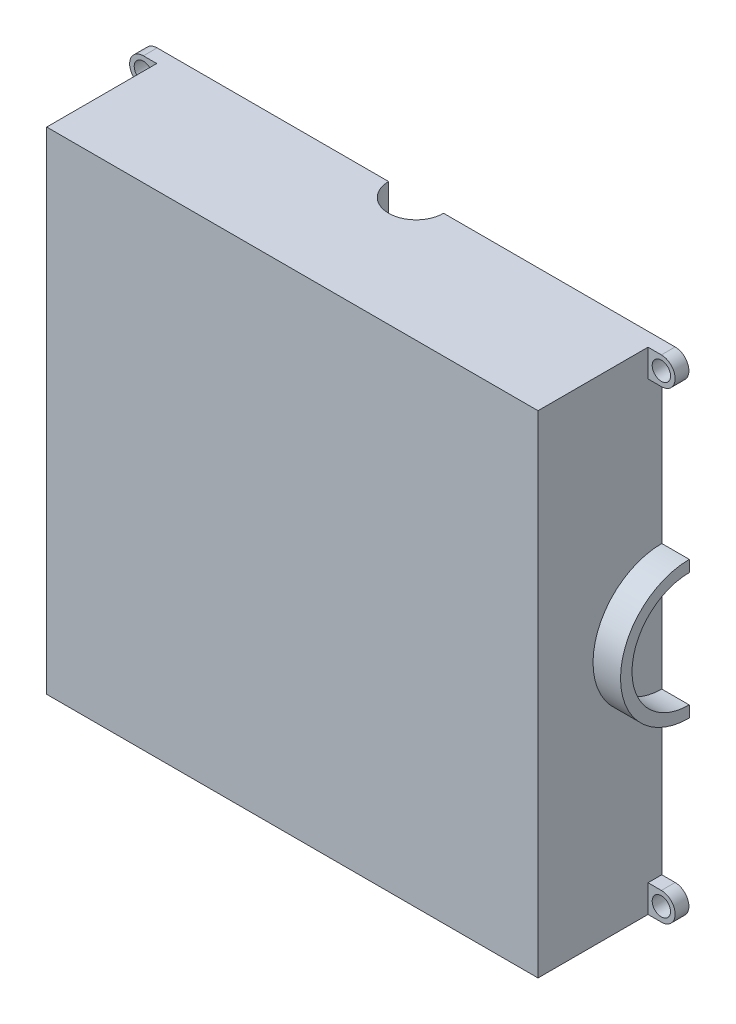
ISO-10303-21;
HEADER;
FILE_DESCRIPTION(('STEP AP214'),'2;1');
FILE_NAME('part.step','',(''),(''),'','','');
FILE_SCHEMA(('AUTOMOTIVE_DESIGN { 1 0 10303 214 1 1 1 1 }'));
ENDSEC;
DATA;
#1=APPLICATION_CONTEXT('core data for automotive mechanical design processes');
#2=APPLICATION_PROTOCOL_DEFINITION('international standard','automotive_design',2000,#1);
#3=PRODUCT_CONTEXT('',#1,'mechanical');
#4=PRODUCT('Part','Part','',(#3));
#5=PRODUCT_RELATED_PRODUCT_CATEGORY('part','',(#4));
#6=PRODUCT_DEFINITION_FORMATION('','',#4);
#7=PRODUCT_DEFINITION_CONTEXT('part definition',#1,'design');
#8=PRODUCT_DEFINITION('design','',#6,#7);
#9=PRODUCT_DEFINITION_SHAPE('','',#8);
#10=(LENGTH_UNIT() NAMED_UNIT(*) SI_UNIT(.MILLI.,.METRE.));
#11=(NAMED_UNIT(*) PLANE_ANGLE_UNIT() SI_UNIT($,.RADIAN.));
#12=(NAMED_UNIT(*) SI_UNIT($,.STERADIAN.) SOLID_ANGLE_UNIT());
#13=UNCERTAINTY_MEASURE_WITH_UNIT(LENGTH_MEASURE(1.E-05),#10,'distance_accuracy_value','');
#14=(GEOMETRIC_REPRESENTATION_CONTEXT(3) GLOBAL_UNCERTAINTY_ASSIGNED_CONTEXT((#13)) GLOBAL_UNIT_ASSIGNED_CONTEXT((#10,
#11,#12)) REPRESENTATION_CONTEXT('',''));
#15=CARTESIAN_POINT('',(0.,0.,0.));
#16=DIRECTION('',(0.,0.,1.));
#17=DIRECTION('',(1.,0.,0.));
#18=AXIS2_PLACEMENT_3D('',#15,#16,#17);
#19=CARTESIAN_POINT('',(53.59,-53.59,-27.));
#20=DIRECTION('',(-1.,0.,0.));
#21=DIRECTION('',(0.,0.,-1.));
#22=AXIS2_PLACEMENT_3D('',#19,#20,#21);
#23=PLANE('',#22);
#24=DIRECTION('',(0.,1.,0.));
#25=VECTOR('',#24,1.);
#26=CARTESIAN_POINT('',(53.59,-53.59,-27.));
#27=LINE('',#26,#25);
#28=CARTESIAN_POINT('',(53.59,-12.5,-27.));
#29=VERTEX_POINT('',#28);
#30=CARTESIAN_POINT('',(53.59,12.5,-27.));
#31=VERTEX_POINT('',#30);
#32=EDGE_CURVE('E406',#29,#31,#27,.T.);
#33=ORIENTED_EDGE('',*,*,#32,.T.);
#34=CARTESIAN_POINT('',(53.59,0.,-27.));
#35=DIRECTION('',(-1.,0.,0.));
#36=DIRECTION('',(0.,0.,1.));
#37=AXIS2_PLACEMENT_3D('',#34,#35,#36);
#38=CIRCLE('',#37,12.5);
#39=EDGE_CURVE('E337',#29,#31,#38,.T.);
#40=ORIENTED_EDGE('',*,*,#39,.F.);
#41=EDGE_LOOP('',(#33,#40));
#42=FACE_BOUND('',#41,.T.);
#43=ADVANCED_FACE('F43',(#42),#23,.F.);
#44=CARTESIAN_POINT('',(-53.59,53.59,-27.));
#45=DIRECTION('',(0.,-1.,0.));
#46=DIRECTION('',(0.,0.,1.));
#47=AXIS2_PLACEMENT_3D('',#44,#45,#46);
#48=PLANE('',#47);
#49=DIRECTION('',(-1.,0.,0.));
#50=VECTOR('',#49,1.);
#51=CARTESIAN_POINT('',(-53.59,53.59,-27.));
#52=LINE('',#51,#50);
#53=CARTESIAN_POINT('',(56.5,53.59,-27.));
#54=VERTEX_POINT('',#53);
#55=CARTESIAN_POINT('',(6.,53.59,-27.));
#56=VERTEX_POINT('',#55);
#57=EDGE_CURVE('E252',#54,#56,#52,.T.);
#58=ORIENTED_EDGE('',*,*,#57,.T.);
#59=CARTESIAN_POINT('',(0.,53.59,-27.));
#60=DIRECTION('',(0.,-1.,0.));
#61=DIRECTION('',(0.,0.,-1.));
#62=AXIS2_PLACEMENT_3D('',#59,#60,#61);
#63=CIRCLE('',#62,6.);
#64=CARTESIAN_POINT('',(-6.,53.59,-27.));
#65=VERTEX_POINT('',#64);
#66=EDGE_CURVE('E358',#56,#65,#63,.T.);
#67=ORIENTED_EDGE('',*,*,#66,.T.);
#68=CARTESIAN_POINT('',(-56.5,53.59,-27.));
#69=VERTEX_POINT('',#68);
#70=EDGE_CURVE('E410',#65,#69,#52,.T.);
#71=ORIENTED_EDGE('',*,*,#70,.T.);
#72=DIRECTION('',(0.,0.,-1.));
#73=VECTOR('',#72,1.);
#74=CARTESIAN_POINT('',(-56.5,53.59,-24.));
#75=LINE('',#74,#73);
#76=CARTESIAN_POINT('',(-56.5,53.59,-24.));
#77=VERTEX_POINT('',#76);
#78=EDGE_CURVE('E329',#77,#69,#75,.T.);
#79=ORIENTED_EDGE('',*,*,#78,.F.);
#80=DIRECTION('',(-1.,0.,0.));
#81=VECTOR('',#80,1.);
#82=CARTESIAN_POINT('',(-56.5,53.59,-24.));
#83=LINE('',#82,#81);
#84=CARTESIAN_POINT('',(-53.59,53.59,-24.));
#85=VERTEX_POINT('',#84);
#86=EDGE_CURVE('E325',#85,#77,#83,.T.);
#87=ORIENTED_EDGE('',*,*,#86,.F.);
#88=DIRECTION('',(0.,0.,1.));
#89=VECTOR('',#88,1.);
#90=CARTESIAN_POINT('',(-53.59,53.59,-27.));
#91=LINE('',#90,#89);
#92=CARTESIAN_POINT('',(-53.59,53.59,0.));
#93=VERTEX_POINT('',#92);
#94=EDGE_CURVE('E432',#85,#93,#91,.T.);
#95=ORIENTED_EDGE('',*,*,#94,.T.);
#96=DIRECTION('',(-1.,0.,0.));
#97=VECTOR('',#96,1.);
#98=CARTESIAN_POINT('',(-53.59,53.59,0.));
#99=LINE('',#98,#97);
#100=CARTESIAN_POINT('',(53.59,53.59,0.));
#101=VERTEX_POINT('',#100);
#102=EDGE_CURVE('E425',#101,#93,#99,.T.);
#103=ORIENTED_EDGE('',*,*,#102,.F.);
#104=DIRECTION('',(0.,0.,1.));
#105=VECTOR('',#104,1.);
#106=CARTESIAN_POINT('',(53.59,53.59,-27.));
#107=LINE('',#106,#105);
#108=CARTESIAN_POINT('',(53.59,53.59,-24.));
#109=VERTEX_POINT('',#108);
#110=EDGE_CURVE('E440',#109,#101,#107,.T.);
#111=ORIENTED_EDGE('',*,*,#110,.F.);
#112=DIRECTION('',(-1.,0.,0.));
#113=VECTOR('',#112,1.);
#114=CARTESIAN_POINT('',(51.1723022861703,53.59,-24.));
#115=LINE('',#114,#113);
#116=CARTESIAN_POINT('',(56.5,53.59,-24.));
#117=VERTEX_POINT('',#116);
#118=EDGE_CURVE('E257',#117,#109,#115,.T.);
#119=ORIENTED_EDGE('',*,*,#118,.F.);
#120=DIRECTION('',(0.,0.,-1.));
#121=VECTOR('',#120,1.);
#122=CARTESIAN_POINT('',(56.5,53.59,-24.));
#123=LINE('',#122,#121);
#124=EDGE_CURVE('E240',#117,#54,#123,.T.);
#125=ORIENTED_EDGE('',*,*,#124,.T.);
#126=EDGE_LOOP('',(#58,#67,#71,#79,#87,#95,#103,#111,#119,#125));
#127=FACE_BOUND('',#126,.T.);
#128=ADVANCED_FACE('F458',(#127),#48,.F.);
#129=CARTESIAN_POINT('',(0.,0.,-27.));
#130=DIRECTION('',(0.,0.,1.));
#131=DIRECTION('',(-1.,0.,0.));
#132=AXIS2_PLACEMENT_3D('',#129,#130,#131);
#133=PLANE('',#132);
#134=ORIENTED_EDGE('',*,*,#70,.F.);
#135=DIRECTION('',(0.,1.,0.));
#136=VECTOR('',#135,1.);
#137=CARTESIAN_POINT('',(-6.,-53.59,-27.));
#138=LINE('',#137,#136);
#139=CARTESIAN_POINT('',(-6.,46.,-27.));
#140=VERTEX_POINT('',#139);
#141=EDGE_CURVE('E366',#140,#65,#138,.T.);
#142=ORIENTED_EDGE('',*,*,#141,.F.);
#143=DIRECTION('',(-1.,0.,0.));
#144=VECTOR('',#143,1.);
#145=CARTESIAN_POINT('',(-46.,46.,-27.));
#146=LINE('',#145,#144);
#147=CARTESIAN_POINT('',(-46.,46.,-27.));
#148=VERTEX_POINT('',#147);
#149=EDGE_CURVE('E389',#140,#148,#146,.T.);
#150=ORIENTED_EDGE('',*,*,#149,.T.);
#151=DIRECTION('',(0.,-1.,0.));
#152=VECTOR('',#151,1.);
#153=CARTESIAN_POINT('',(-46.,46.,-27.));
#154=LINE('',#153,#152);
#155=CARTESIAN_POINT('',(-46.,-46.,-27.));
#156=VERTEX_POINT('',#155);
#157=EDGE_CURVE('E394',#148,#156,#154,.T.);
#158=ORIENTED_EDGE('',*,*,#157,.T.);
#159=DIRECTION('',(1.,0.,0.));
#160=VECTOR('',#159,1.);
#161=CARTESIAN_POINT('',(-46.,-46.,-27.));
#162=LINE('',#161,#160);
#163=CARTESIAN_POINT('',(-6.,-46.,-27.));
#164=VERTEX_POINT('',#163);
#165=EDGE_CURVE('E378',#156,#164,#162,.T.);
#166=ORIENTED_EDGE('',*,*,#165,.T.);
#167=CARTESIAN_POINT('',(-6.,-53.59,-27.));
#168=VERTEX_POINT('',#167);
#169=EDGE_CURVE('E375',#168,#164,#138,.T.);
#170=ORIENTED_EDGE('',*,*,#169,.F.);
#171=DIRECTION('',(1.,0.,0.));
#172=VECTOR('',#171,1.);
#173=CARTESIAN_POINT('',(-53.59,-53.59,-27.));
#174=LINE('',#173,#172);
#175=CARTESIAN_POINT('',(-56.5,-53.59,-27.));
#176=VERTEX_POINT('',#175);
#177=EDGE_CURVE('E417',#176,#168,#174,.T.);
#178=ORIENTED_EDGE('',*,*,#177,.F.);
#179=CARTESIAN_POINT('',(-56.5,-50.59,-27.));
#180=DIRECTION('',(0.,0.,1.));
#181=DIRECTION('',(-1.,0.,0.));
#182=AXIS2_PLACEMENT_3D('',#179,#180,#181);
#183=CIRCLE('',#182,3.00000000000001);
#184=CARTESIAN_POINT('',(-56.5,-47.59,-27.));
#185=VERTEX_POINT('',#184);
#186=EDGE_CURVE('E299',#185,#176,#183,.T.);
#187=ORIENTED_EDGE('',*,*,#186,.F.);
#188=DIRECTION('',(-1.,0.,0.));
#189=VECTOR('',#188,1.);
#190=CARTESIAN_POINT('',(-56.5,-47.59,-27.));
#191=LINE('',#190,#189);
#192=CARTESIAN_POINT('',(-53.59,-47.59,-27.));
#193=VERTEX_POINT('',#192);
#194=EDGE_CURVE('E294',#193,#185,#191,.T.);
#195=ORIENTED_EDGE('',*,*,#194,.F.);
#196=DIRECTION('',(0.,-1.,0.));
#197=VECTOR('',#196,1.);
#198=CARTESIAN_POINT('',(-53.59,-53.59,-27.));
#199=LINE('',#198,#197);
#200=CARTESIAN_POINT('',(-53.59,47.59,-27.));
#201=VERTEX_POINT('',#200);
#202=EDGE_CURVE('E414',#201,#193,#199,.T.);
#203=ORIENTED_EDGE('',*,*,#202,.F.);
#204=DIRECTION('',(1.,0.,0.));
#205=VECTOR('',#204,1.);
#206=CARTESIAN_POINT('',(-56.5,47.59,-27.));
#207=LINE('',#206,#205);
#208=CARTESIAN_POINT('',(-56.5,47.59,-27.));
#209=VERTEX_POINT('',#208);
#210=EDGE_CURVE('E319',#209,#201,#207,.T.);
#211=ORIENTED_EDGE('',*,*,#210,.F.);
#212=CARTESIAN_POINT('',(-56.5,50.59,-27.));
#213=DIRECTION('',(0.,0.,1.));
#214=DIRECTION('',(1.,0.,0.));
#215=AXIS2_PLACEMENT_3D('',#212,#213,#214);
#216=CIRCLE('',#215,3.00000000000001);
#217=EDGE_CURVE('E314',#69,#209,#216,.T.);
#218=ORIENTED_EDGE('',*,*,#217,.F.);
#219=EDGE_LOOP('',(#134,#142,#150,#158,#166,#170,#178,#187,#195,#203,#211,#218));
#220=FACE_BOUND('',#219,.T.);
#221=CARTESIAN_POINT('',(-56.5,50.59,-27.));
#222=DIRECTION('',(0.,0.,1.));
#223=DIRECTION('',(1.,0.,0.));
#224=AXIS2_PLACEMENT_3D('',#221,#222,#223);
#225=CIRCLE('',#224,2.);
#226=CARTESIAN_POINT('',(-54.5,50.59,-27.));
#227=VERTEX_POINT('',#226);
#228=EDGE_CURVE('E264',#227,#227,#225,.T.);
#229=ORIENTED_EDGE('',*,*,#228,.T.);
#230=EDGE_LOOP('',(#229));
#231=FACE_BOUND('',#230,.T.);
#232=CARTESIAN_POINT('',(-56.5,-50.59,-27.));
#233=DIRECTION('',(0.,0.,1.));
#234=DIRECTION('',(-1.,0.,0.));
#235=AXIS2_PLACEMENT_3D('',#232,#233,#234);
#236=CIRCLE('',#235,2.);
#237=CARTESIAN_POINT('',(-58.5,-50.59,-27.));
#238=VERTEX_POINT('',#237);
#239=EDGE_CURVE('E275',#238,#238,#236,.T.);
#240=ORIENTED_EDGE('',*,*,#239,.T.);
#241=EDGE_LOOP('',(#240));
#242=FACE_BOUND('',#241,.T.);
#243=ADVANCED_FACE('F487',(#220,#231,#242),#133,.F.);
#244=CARTESIAN_POINT('',(53.59,-47.59,-27.));
#245=VERTEX_POINT('',#244);
#246=CARTESIAN_POINT('',(53.59,-15.,-27.));
#247=VERTEX_POINT('',#246);
#248=EDGE_CURVE('E408',#245,#247,#27,.T.);
#249=ORIENTED_EDGE('',*,*,#248,.T.);
#250=CARTESIAN_POINT('',(53.59,0.,-27.));
#251=DIRECTION('',(-1.,0.,0.));
#252=DIRECTION('',(0.,0.,1.));
#253=AXIS2_PLACEMENT_3D('',#250,#251,#252);
#254=CIRCLE('',#253,15.);
#255=CARTESIAN_POINT('',(53.59,15.,-27.));
#256=VERTEX_POINT('',#255);
#257=EDGE_CURVE('E345',#247,#256,#254,.T.);
#258=ORIENTED_EDGE('',*,*,#257,.T.);
#259=CARTESIAN_POINT('',(53.59,47.59,-27.));
#260=VERTEX_POINT('',#259);
#261=EDGE_CURVE('E412',#256,#260,#27,.T.);
#262=ORIENTED_EDGE('',*,*,#261,.T.);
#263=DIRECTION('',(0.,0.,-1.));
#264=VECTOR('',#263,1.);
#265=CARTESIAN_POINT('',(53.59,47.59,-27.));
#266=LINE('',#265,#264);
#267=CARTESIAN_POINT('',(53.59,47.59,-24.));
#268=VERTEX_POINT('',#267);
#269=EDGE_CURVE('E242',#268,#260,#266,.T.);
#270=ORIENTED_EDGE('',*,*,#269,.F.);
#271=DIRECTION('',(0.,1.,0.));
#272=VECTOR('',#271,1.);
#273=CARTESIAN_POINT('',(53.59,-53.59,-24.));
#274=LINE('',#273,#272);
#275=EDGE_CURVE('E51',#268,#109,#274,.T.);
#276=ORIENTED_EDGE('',*,*,#275,.T.);
#277=ORIENTED_EDGE('',*,*,#110,.T.);
#278=DIRECTION('',(0.,1.,0.));
#279=VECTOR('',#278,1.);
#280=CARTESIAN_POINT('',(53.59,-53.59,0.));
#281=LINE('',#280,#279);
#282=CARTESIAN_POINT('',(53.59,-53.59,0.));
#283=VERTEX_POINT('',#282);
#284=EDGE_CURVE('E398',#283,#101,#281,.T.);
#285=ORIENTED_EDGE('',*,*,#284,.F.);
#286=DIRECTION('',(0.,0.,1.));
#287=VECTOR('',#286,1.);
#288=CARTESIAN_POINT('',(53.59,-53.59,-27.));
#289=LINE('',#288,#287);
#290=CARTESIAN_POINT('',(53.59,-53.59,-24.));
#291=VERTEX_POINT('',#290);
#292=EDGE_CURVE('E419',#291,#283,#289,.T.);
#293=ORIENTED_EDGE('',*,*,#292,.F.);
#294=DIRECTION('',(0.,-1.,0.));
#295=VECTOR('',#294,1.);
#296=CARTESIAN_POINT('',(53.59,-53.59,-24.));
#297=LINE('',#296,#295);
#298=CARTESIAN_POINT('',(53.59,-47.59,-24.));
#299=VERTEX_POINT('',#298);
#300=EDGE_CURVE('E11',#299,#291,#297,.T.);
#301=ORIENTED_EDGE('',*,*,#300,.F.);
#302=DIRECTION('',(0.,0.,1.));
#303=VECTOR('',#302,1.);
#304=CARTESIAN_POINT('',(53.59,-47.59,-27.));
#305=LINE('',#304,#303);
#306=EDGE_CURVE('E333',#245,#299,#305,.T.);
#307=ORIENTED_EDGE('',*,*,#306,.F.);
#308=EDGE_LOOP('',(#249,#258,#262,#270,#276,#277,#285,#293,#301,#307));
#309=FACE_BOUND('',#308,.T.);
#310=ADVANCED_FACE('F44',(#309),#23,.F.);
#311=CARTESIAN_POINT('',(-53.59,-53.59,-27.));
#312=DIRECTION('',(1.,0.,0.));
#313=DIRECTION('',(0.,0.,1.));
#314=AXIS2_PLACEMENT_3D('',#311,#312,#313);
#315=PLANE('',#314);
#316=DIRECTION('',(0.,1.,0.));
#317=VECTOR('',#316,1.);
#318=CARTESIAN_POINT('',(-53.59,-53.59,-24.));
#319=LINE('',#318,#317);
#320=CARTESIAN_POINT('',(-53.59,-53.59,-24.));
#321=VERTEX_POINT('',#320);
#322=CARTESIAN_POINT('',(-53.59,-47.59,-24.));
#323=VERTEX_POINT('',#322);
#324=EDGE_CURVE('E447',#321,#323,#319,.T.);
#325=ORIENTED_EDGE('',*,*,#324,.F.);
#326=DIRECTION('',(0.,0.,1.));
#327=VECTOR('',#326,1.);
#328=CARTESIAN_POINT('',(-53.59,-53.59,-27.));
#329=LINE('',#328,#327);
#330=CARTESIAN_POINT('',(-53.59,-53.59,0.));
#331=VERTEX_POINT('',#330);
#332=EDGE_CURVE('E431',#321,#331,#329,.T.);
#333=ORIENTED_EDGE('',*,*,#332,.T.);
#334=DIRECTION('',(0.,-1.,0.));
#335=VECTOR('',#334,1.);
#336=CARTESIAN_POINT('',(-53.59,-53.59,0.));
#337=LINE('',#336,#335);
#338=EDGE_CURVE('E422',#93,#331,#337,.T.);
#339=ORIENTED_EDGE('',*,*,#338,.F.);
#340=ORIENTED_EDGE('',*,*,#94,.F.);
#341=DIRECTION('',(0.,-1.,0.));
#342=VECTOR('',#341,1.);
#343=CARTESIAN_POINT('',(-53.59,-53.59,-24.));
#344=LINE('',#343,#342);
#345=CARTESIAN_POINT('',(-53.59,47.59,-24.));
#346=VERTEX_POINT('',#345);
#347=EDGE_CURVE('E445',#85,#346,#344,.T.);
#348=ORIENTED_EDGE('',*,*,#347,.T.);
#349=DIRECTION('',(0.,0.,1.));
#350=VECTOR('',#349,1.);
#351=CARTESIAN_POINT('',(-53.59,47.59,-27.));
#352=LINE('',#351,#350);
#353=EDGE_CURVE('E443',#201,#346,#352,.T.);
#354=ORIENTED_EDGE('',*,*,#353,.F.);
#355=ORIENTED_EDGE('',*,*,#202,.T.);
#356=DIRECTION('',(0.,0.,-1.));
#357=VECTOR('',#356,1.);
#358=CARTESIAN_POINT('',(-53.59,-47.59,-27.));
#359=LINE('',#358,#357);
#360=EDGE_CURVE('E452',#323,#193,#359,.T.);
#361=ORIENTED_EDGE('',*,*,#360,.F.);
#362=EDGE_LOOP('',(#325,#333,#339,#340,#348,#354,#355,#361));
#363=FACE_BOUND('',#362,.T.);
#364=ADVANCED_FACE('F475',(#363),#315,.F.);
#365=CARTESIAN_POINT('',(-53.59,-53.59,-27.));
#366=DIRECTION('',(0.,1.,0.));
#367=DIRECTION('',(0.,0.,-1.));
#368=AXIS2_PLACEMENT_3D('',#365,#366,#367);
#369=PLANE('',#368);
#370=ORIENTED_EDGE('',*,*,#177,.T.);
#371=CARTESIAN_POINT('',(0.,-53.59,-27.));
#372=DIRECTION('',(0.,-1.,0.));
#373=DIRECTION('',(0.,0.,-1.));
#374=AXIS2_PLACEMENT_3D('',#371,#372,#373);
#375=CIRCLE('',#374,6.);
#376=CARTESIAN_POINT('',(6.,-53.59,-27.));
#377=VERTEX_POINT('',#376);
#378=EDGE_CURVE('E363',#377,#168,#375,.T.);
#379=ORIENTED_EDGE('',*,*,#378,.F.);
#380=CARTESIAN_POINT('',(56.5,-53.59,-27.));
#381=VERTEX_POINT('',#380);
#382=EDGE_CURVE('E418',#377,#381,#174,.T.);
#383=ORIENTED_EDGE('',*,*,#382,.T.);
#384=DIRECTION('',(0.,0.,-1.));
#385=VECTOR('',#384,1.);
#386=CARTESIAN_POINT('',(56.5,-53.59,-24.));
#387=LINE('',#386,#385);
#388=CARTESIAN_POINT('',(56.5,-53.59,-24.));
#389=VERTEX_POINT('',#388);
#390=EDGE_CURVE('E267',#389,#381,#387,.T.);
#391=ORIENTED_EDGE('',*,*,#390,.F.);
#392=DIRECTION('',(1.,0.,0.));
#393=VECTOR('',#392,1.);
#394=CARTESIAN_POINT('',(51.1723022861703,-53.59,-24.));
#395=LINE('',#394,#393);
#396=EDGE_CURVE('E67',#291,#389,#395,.T.);
#397=ORIENTED_EDGE('',*,*,#396,.F.);
#398=ORIENTED_EDGE('',*,*,#292,.T.);
#399=DIRECTION('',(1.,0.,0.));
#400=VECTOR('',#399,1.);
#401=CARTESIAN_POINT('',(-53.59,-53.59,0.));
#402=LINE('',#401,#400);
#403=EDGE_CURVE('E428',#331,#283,#402,.T.);
#404=ORIENTED_EDGE('',*,*,#403,.F.);
#405=ORIENTED_EDGE('',*,*,#332,.F.);
#406=DIRECTION('',(1.,0.,0.));
#407=VECTOR('',#406,1.);
#408=CARTESIAN_POINT('',(-56.5,-53.59,-24.));
#409=LINE('',#408,#407);
#410=CARTESIAN_POINT('',(-56.5,-53.59,-24.));
#411=VERTEX_POINT('',#410);
#412=EDGE_CURVE('E301',#411,#321,#409,.T.);
#413=ORIENTED_EDGE('',*,*,#412,.F.);
#414=DIRECTION('',(0.,0.,-1.));
#415=VECTOR('',#414,1.);
#416=CARTESIAN_POINT('',(-56.5,-53.59,-24.));
#417=LINE('',#416,#415);
#418=EDGE_CURVE('E286',#411,#176,#417,.T.);
#419=ORIENTED_EDGE('',*,*,#418,.T.);
#420=EDGE_LOOP('',(#370,#379,#383,#391,#397,#398,#404,#405,#413,#419));
#421=FACE_BOUND('',#420,.T.);
#422=ADVANCED_FACE('F469',(#421),#369,.F.);
#423=ORIENTED_EDGE('',*,*,#57,.F.);
#424=CARTESIAN_POINT('',(56.5,50.59,-27.));
#425=DIRECTION('',(0.,0.,1.));
#426=DIRECTION('',(1.,0.,0.));
#427=AXIS2_PLACEMENT_3D('',#424,#425,#426);
#428=CIRCLE('',#427,3.00000000000001);
#429=CARTESIAN_POINT('',(56.5,47.59,-27.));
#430=VERTEX_POINT('',#429);
#431=EDGE_CURVE('E231',#430,#54,#428,.T.);
#432=ORIENTED_EDGE('',*,*,#431,.F.);
#433=DIRECTION('',(1.,0.,0.));
#434=VECTOR('',#433,1.);
#435=CARTESIAN_POINT('',(51.1723022861703,47.59,-27.));
#436=LINE('',#435,#434);
#437=EDGE_CURVE('E238',#260,#430,#436,.T.);
#438=ORIENTED_EDGE('',*,*,#437,.F.);
#439=ORIENTED_EDGE('',*,*,#261,.F.);
#440=DIRECTION('',(-1.,0.,0.));
#441=VECTOR('',#440,1.);
#442=CARTESIAN_POINT('',(59.59,15.,-27.));
#443=LINE('',#442,#441);
#444=CARTESIAN_POINT('',(59.59,15.,-27.));
#445=VERTEX_POINT('',#444);
#446=EDGE_CURVE('E355',#445,#256,#443,.T.);
#447=ORIENTED_EDGE('',*,*,#446,.F.);
#448=DIRECTION('',(0.,-1.,0.));
#449=VECTOR('',#448,1.);
#450=CARTESIAN_POINT('',(59.59,0.,-27.));
#451=LINE('',#450,#449);
#452=CARTESIAN_POINT('',(59.59,12.5,-27.));
#453=VERTEX_POINT('',#452);
#454=EDGE_CURVE('E347',#445,#453,#451,.T.);
#455=ORIENTED_EDGE('',*,*,#454,.T.);
#456=DIRECTION('',(-1.,0.,0.));
#457=VECTOR('',#456,1.);
#458=CARTESIAN_POINT('',(59.59,12.5,-27.));
#459=LINE('',#458,#457);
#460=EDGE_CURVE('E354',#453,#31,#459,.T.);
#461=ORIENTED_EDGE('',*,*,#460,.T.);
#462=ORIENTED_EDGE('',*,*,#32,.F.);
#463=DIRECTION('',(-1.,0.,0.));
#464=VECTOR('',#463,1.);
#465=CARTESIAN_POINT('',(59.59,-12.5,-27.));
#466=LINE('',#465,#464);
#467=CARTESIAN_POINT('',(59.59,-12.5,-27.));
#468=VERTEX_POINT('',#467);
#469=EDGE_CURVE('E359',#468,#29,#466,.T.);
#470=ORIENTED_EDGE('',*,*,#469,.F.);
#471=CARTESIAN_POINT('',(59.59,-15.,-27.));
#472=VERTEX_POINT('',#471);
#473=EDGE_CURVE('E342',#468,#472,#451,.T.);
#474=ORIENTED_EDGE('',*,*,#473,.T.);
#475=DIRECTION('',(-1.,0.,0.));
#476=VECTOR('',#475,1.);
#477=CARTESIAN_POINT('',(59.59,-15.,-27.));
#478=LINE('',#477,#476);
#479=EDGE_CURVE('E357',#472,#247,#478,.T.);
#480=ORIENTED_EDGE('',*,*,#479,.T.);
#481=ORIENTED_EDGE('',*,*,#248,.F.);
#482=DIRECTION('',(-1.,0.,0.));
#483=VECTOR('',#482,1.);
#484=CARTESIAN_POINT('',(51.1723022861703,-47.59,-27.));
#485=LINE('',#484,#483);
#486=CARTESIAN_POINT('',(56.5,-47.59,-27.));
#487=VERTEX_POINT('',#486);
#488=EDGE_CURVE('E272',#487,#245,#485,.T.);
#489=ORIENTED_EDGE('',*,*,#488,.F.);
#490=CARTESIAN_POINT('',(56.5,-50.59,-27.));
#491=DIRECTION('',(0.,0.,1.));
#492=DIRECTION('',(-1.,0.,0.));
#493=AXIS2_PLACEMENT_3D('',#490,#491,#492);
#494=CIRCLE('',#493,3.00000000000001);
#495=EDGE_CURVE('E274',#381,#487,#494,.T.);
#496=ORIENTED_EDGE('',*,*,#495,.F.);
#497=ORIENTED_EDGE('',*,*,#382,.F.);
#498=DIRECTION('',(0.,1.,0.));
#499=VECTOR('',#498,1.);
#500=CARTESIAN_POINT('',(6.,-53.59,-27.));
#501=LINE('',#500,#499);
#502=CARTESIAN_POINT('',(6.,-46.,-27.));
#503=VERTEX_POINT('',#502);
#504=EDGE_CURVE('E369',#503,#377,#501,.F.);
#505=ORIENTED_EDGE('',*,*,#504,.F.);
#506=CARTESIAN_POINT('',(46.,-46.,-27.));
#507=VERTEX_POINT('',#506);
#508=EDGE_CURVE('E391',#503,#507,#162,.T.);
#509=ORIENTED_EDGE('',*,*,#508,.T.);
#510=DIRECTION('',(0.,1.,0.));
#511=VECTOR('',#510,1.);
#512=CARTESIAN_POINT('',(46.,46.,-27.));
#513=LINE('',#512,#511);
#514=CARTESIAN_POINT('',(46.,46.,-27.));
#515=VERTEX_POINT('',#514);
#516=EDGE_CURVE('E384',#507,#515,#513,.T.);
#517=ORIENTED_EDGE('',*,*,#516,.T.);
#518=CARTESIAN_POINT('',(6.,46.,-27.));
#519=VERTEX_POINT('',#518);
#520=EDGE_CURVE('E386',#515,#519,#146,.T.);
#521=ORIENTED_EDGE('',*,*,#520,.T.);
#522=EDGE_CURVE('E361',#56,#519,#501,.F.);
#523=ORIENTED_EDGE('',*,*,#522,.F.);
#524=EDGE_LOOP('',(#423,#432,#438,#439,#447,#455,#461,#462,#470,#474,#480,#481,#489,#496,#497,
#505,#509,#517,#521,#523));
#525=FACE_BOUND('',#524,.T.);
#526=CARTESIAN_POINT('',(56.5,50.59,-27.));
#527=DIRECTION('',(0.,0.,1.));
#528=DIRECTION('',(1.,0.,0.));
#529=AXIS2_PLACEMENT_3D('',#526,#527,#528);
#530=CIRCLE('',#529,2.);
#531=CARTESIAN_POINT('',(58.5,50.59,-27.));
#532=VERTEX_POINT('',#531);
#533=EDGE_CURVE('E258',#532,#532,#530,.T.);
#534=ORIENTED_EDGE('',*,*,#533,.T.);
#535=EDGE_LOOP('',(#534));
#536=FACE_BOUND('',#535,.T.);
#537=CARTESIAN_POINT('',(56.5,-50.59,-27.));
#538=DIRECTION('',(0.,0.,1.));
#539=DIRECTION('',(-1.,0.,0.));
#540=AXIS2_PLACEMENT_3D('',#537,#538,#539);
#541=CIRCLE('',#540,2.);
#542=CARTESIAN_POINT('',(54.5,-50.59,-27.));
#543=VERTEX_POINT('',#542);
#544=EDGE_CURVE('E236',#543,#543,#541,.T.);
#545=ORIENTED_EDGE('',*,*,#544,.T.);
#546=EDGE_LOOP('',(#545));
#547=FACE_BOUND('',#546,.T.);
#548=ADVANCED_FACE('F246',(#525,#536,#547),#133,.F.);
#549=CARTESIAN_POINT('',(0.,0.,0.));
#550=DIRECTION('',(0.,0.,1.));
#551=DIRECTION('',(-1.,0.,0.));
#552=AXIS2_PLACEMENT_3D('',#549,#550,#551);
#553=PLANE('',#552);
#554=ORIENTED_EDGE('',*,*,#284,.T.);
#555=ORIENTED_EDGE('',*,*,#102,.T.);
#556=ORIENTED_EDGE('',*,*,#338,.T.);
#557=ORIENTED_EDGE('',*,*,#403,.T.);
#558=EDGE_LOOP('',(#554,#555,#556,#557));
#559=FACE_BOUND('',#558,.T.);
#560=ADVANCED_FACE('F465',(#559),#553,.T.);
#561=CARTESIAN_POINT('',(46.,46.,-4.));
#562=DIRECTION('',(1.,0.,0.));
#563=DIRECTION('',(0.,1.,0.));
#564=AXIS2_PLACEMENT_3D('',#561,#562,#563);
#565=PLANE('',#564);
#566=ORIENTED_EDGE('',*,*,#516,.F.);
#567=DIRECTION('',(0.,0.,-1.));
#568=VECTOR('',#567,1.);
#569=CARTESIAN_POINT('',(46.,-46.,-4.));
#570=LINE('',#569,#568);
#571=CARTESIAN_POINT('',(46.,-46.,-4.));
#572=VERTEX_POINT('',#571);
#573=EDGE_CURVE('E399',#572,#507,#570,.T.);
#574=ORIENTED_EDGE('',*,*,#573,.F.);
#575=DIRECTION('',(0.,1.,0.));
#576=VECTOR('',#575,1.);
#577=CARTESIAN_POINT('',(46.,46.,-4.));
#578=LINE('',#577,#576);
#579=CARTESIAN_POINT('',(46.,46.,-4.));
#580=VERTEX_POINT('',#579);
#581=EDGE_CURVE('E372',#572,#580,#578,.T.);
#582=ORIENTED_EDGE('',*,*,#581,.T.);
#583=DIRECTION('',(0.,0.,-1.));
#584=VECTOR('',#583,1.);
#585=CARTESIAN_POINT('',(46.,46.,-4.));
#586=LINE('',#585,#584);
#587=EDGE_CURVE('E383',#580,#515,#586,.T.);
#588=ORIENTED_EDGE('',*,*,#587,.T.);
#589=EDGE_LOOP('',(#566,#574,#582,#588));
#590=FACE_BOUND('',#589,.T.);
#591=ADVANCED_FACE('F559',(#590),#565,.F.);
#592=CARTESIAN_POINT('',(-46.,-46.,-4.));
#593=DIRECTION('',(0.,-1.,0.));
#594=DIRECTION('',(0.,0.,1.));
#595=AXIS2_PLACEMENT_3D('',#592,#593,#594);
#596=PLANE('',#595);
#597=ORIENTED_EDGE('',*,*,#165,.F.);
#598=DIRECTION('',(0.,0.,-1.));
#599=VECTOR('',#598,1.);
#600=CARTESIAN_POINT('',(-46.,-46.,-4.));
#601=LINE('',#600,#599);
#602=CARTESIAN_POINT('',(-46.,-46.,-4.));
#603=VERTEX_POINT('',#602);
#604=EDGE_CURVE('E402',#603,#156,#601,.T.);
#605=ORIENTED_EDGE('',*,*,#604,.F.);
#606=DIRECTION('',(1.,0.,0.));
#607=VECTOR('',#606,1.);
#608=CARTESIAN_POINT('',(-46.,-46.,-4.));
#609=LINE('',#608,#607);
#610=EDGE_CURVE('E385',#603,#572,#609,.T.);
#611=ORIENTED_EDGE('',*,*,#610,.T.);
#612=ORIENTED_EDGE('',*,*,#573,.T.);
#613=ORIENTED_EDGE('',*,*,#508,.F.);
#614=CARTESIAN_POINT('',(0.,-46.,-27.));
#615=DIRECTION('',(0.,1.,0.));
#616=DIRECTION('',(0.,0.,1.));
#617=AXIS2_PLACEMENT_3D('',#614,#615,#616);
#618=CIRCLE('',#617,6.);
#619=EDGE_CURVE('E371',#164,#503,#618,.T.);
#620=ORIENTED_EDGE('',*,*,#619,.F.);
#621=EDGE_LOOP('',(#597,#605,#611,#612,#613,#620));
#622=FACE_BOUND('',#621,.T.);
#623=ADVANCED_FACE('F591',(#622),#596,.F.);
#624=CARTESIAN_POINT('',(-46.,46.,-4.));
#625=DIRECTION('',(-1.,0.,0.));
#626=DIRECTION('',(0.,-1.,0.));
#627=AXIS2_PLACEMENT_3D('',#624,#625,#626);
#628=PLANE('',#627);
#629=ORIENTED_EDGE('',*,*,#157,.F.);
#630=DIRECTION('',(0.,0.,-1.));
#631=VECTOR('',#630,1.);
#632=CARTESIAN_POINT('',(-46.,46.,-4.));
#633=LINE('',#632,#631);
#634=CARTESIAN_POINT('',(-46.,46.,-4.));
#635=VERTEX_POINT('',#634);
#636=EDGE_CURVE('E401',#635,#148,#633,.T.);
#637=ORIENTED_EDGE('',*,*,#636,.F.);
#638=DIRECTION('',(0.,-1.,0.));
#639=VECTOR('',#638,1.);
#640=CARTESIAN_POINT('',(-46.,46.,-4.));
#641=LINE('',#640,#639);
#642=EDGE_CURVE('E379',#635,#603,#641,.T.);
#643=ORIENTED_EDGE('',*,*,#642,.T.);
#644=ORIENTED_EDGE('',*,*,#604,.T.);
#645=EDGE_LOOP('',(#629,#637,#643,#644));
#646=FACE_BOUND('',#645,.T.);
#647=ADVANCED_FACE('F597',(#646),#628,.F.);
#648=CARTESIAN_POINT('',(-46.,46.,-4.));
#649=DIRECTION('',(0.,1.,0.));
#650=DIRECTION('',(0.,0.,-1.));
#651=AXIS2_PLACEMENT_3D('',#648,#649,#650);
#652=PLANE('',#651);
#653=ORIENTED_EDGE('',*,*,#520,.F.);
#654=ORIENTED_EDGE('',*,*,#587,.F.);
#655=DIRECTION('',(-1.,0.,0.));
#656=VECTOR('',#655,1.);
#657=CARTESIAN_POINT('',(-46.,46.,-4.));
#658=LINE('',#657,#656);
#659=EDGE_CURVE('E380',#580,#635,#658,.T.);
#660=ORIENTED_EDGE('',*,*,#659,.T.);
#661=ORIENTED_EDGE('',*,*,#636,.T.);
#662=ORIENTED_EDGE('',*,*,#149,.F.);
#663=CARTESIAN_POINT('',(0.,46.,-27.));
#664=DIRECTION('',(0.,-1.,0.));
#665=DIRECTION('',(0.,0.,-1.));
#666=AXIS2_PLACEMENT_3D('',#663,#664,#665);
#667=CIRCLE('',#666,6.);
#668=EDGE_CURVE('E439',#519,#140,#667,.T.);
#669=ORIENTED_EDGE('',*,*,#668,.F.);
#670=EDGE_LOOP('',(#653,#654,#660,#661,#662,#669));
#671=FACE_BOUND('',#670,.T.);
#672=ADVANCED_FACE('F609',(#671),#652,.F.);
#673=CARTESIAN_POINT('',(0.,0.,-4.));
#674=DIRECTION('',(0.,0.,-1.));
#675=DIRECTION('',(1.,0.,0.));
#676=AXIS2_PLACEMENT_3D('',#673,#674,#675);
#677=PLANE('',#676);
#678=ORIENTED_EDGE('',*,*,#581,.F.);
#679=ORIENTED_EDGE('',*,*,#610,.F.);
#680=ORIENTED_EDGE('',*,*,#642,.F.);
#681=ORIENTED_EDGE('',*,*,#659,.F.);
#682=EDGE_LOOP('',(#678,#679,#680,#681));
#683=FACE_BOUND('',#682,.T.);
#684=ADVANCED_FACE('F620',(#683),#677,.T.);
#685=CARTESIAN_POINT('',(0.,-53.59,-27.));
#686=DIRECTION('',(0.,1.,0.));
#687=DIRECTION('',(0.,0.,-1.));
#688=AXIS2_PLACEMENT_3D('',#685,#686,#687);
#689=CYLINDRICAL_SURFACE('',#688,6.);
#690=ORIENTED_EDGE('',*,*,#668,.T.);
#691=ORIENTED_EDGE('',*,*,#141,.T.);
#692=ORIENTED_EDGE('',*,*,#66,.F.);
#693=ORIENTED_EDGE('',*,*,#522,.T.);
#694=EDGE_LOOP('',(#690,#691,#692,#693));
#695=FACE_BOUND('',#694,.T.);
#696=ADVANCED_FACE('F628',(#695),#689,.F.);
#697=ORIENTED_EDGE('',*,*,#378,.T.);
#698=ORIENTED_EDGE('',*,*,#169,.T.);
#699=ORIENTED_EDGE('',*,*,#619,.T.);
#700=ORIENTED_EDGE('',*,*,#504,.T.);
#701=EDGE_LOOP('',(#697,#698,#699,#700));
#702=FACE_BOUND('',#701,.T.);
#703=ADVANCED_FACE('F494',(#702),#689,.F.);
#704=CARTESIAN_POINT('',(59.59,0.,-27.));
#705=DIRECTION('',(-1.,0.,0.));
#706=DIRECTION('',(0.,0.,-1.));
#707=AXIS2_PLACEMENT_3D('',#704,#705,#706);
#708=CYLINDRICAL_SURFACE('',#707,12.5);
#709=ORIENTED_EDGE('',*,*,#39,.T.);
#710=ORIENTED_EDGE('',*,*,#460,.F.);
#711=CARTESIAN_POINT('',(59.59,0.,-27.));
#712=DIRECTION('',(-1.,0.,0.));
#713=DIRECTION('',(0.,0.,1.));
#714=AXIS2_PLACEMENT_3D('',#711,#712,#713);
#715=CIRCLE('',#714,12.5);
#716=EDGE_CURVE('E340',#468,#453,#715,.T.);
#717=ORIENTED_EDGE('',*,*,#716,.F.);
#718=ORIENTED_EDGE('',*,*,#469,.T.);
#719=EDGE_LOOP('',(#709,#710,#717,#718));
#720=FACE_BOUND('',#719,.T.);
#721=ADVANCED_FACE('F525',(#720),#708,.F.);
#722=CARTESIAN_POINT('',(59.59,0.,-27.));
#723=DIRECTION('',(-1.,0.,0.));
#724=DIRECTION('',(0.,0.,-1.));
#725=AXIS2_PLACEMENT_3D('',#722,#723,#724);
#726=CYLINDRICAL_SURFACE('',#725,15.);
#727=ORIENTED_EDGE('',*,*,#257,.F.);
#728=ORIENTED_EDGE('',*,*,#479,.F.);
#729=CARTESIAN_POINT('',(59.59,0.,-27.));
#730=DIRECTION('',(-1.,0.,0.));
#731=DIRECTION('',(0.,0.,1.));
#732=AXIS2_PLACEMENT_3D('',#729,#730,#731);
#733=CIRCLE('',#732,15.);
#734=EDGE_CURVE('E343',#472,#445,#733,.T.);
#735=ORIENTED_EDGE('',*,*,#734,.T.);
#736=ORIENTED_EDGE('',*,*,#446,.T.);
#737=EDGE_LOOP('',(#727,#728,#735,#736));
#738=FACE_BOUND('',#737,.T.);
#739=ADVANCED_FACE('F515',(#738),#726,.T.);
#740=CARTESIAN_POINT('',(59.59,0.,0.));
#741=DIRECTION('',(1.,0.,0.));
#742=DIRECTION('',(0.,0.,1.));
#743=AXIS2_PLACEMENT_3D('',#740,#741,#742);
#744=PLANE('',#743);
#745=ORIENTED_EDGE('',*,*,#716,.T.);
#746=ORIENTED_EDGE('',*,*,#454,.F.);
#747=ORIENTED_EDGE('',*,*,#734,.F.);
#748=ORIENTED_EDGE('',*,*,#473,.F.);
#749=EDGE_LOOP('',(#745,#746,#747,#748));
#750=FACE_BOUND('',#749,.T.);
#751=ADVANCED_FACE('F521',(#750),#744,.T.);
#752=CARTESIAN_POINT('',(-56.5,47.59,-24.));
#753=DIRECTION('',(0.,-1.,0.));
#754=DIRECTION('',(0.,0.,1.));
#755=AXIS2_PLACEMENT_3D('',#752,#753,#754);
#756=PLANE('',#755);
#757=ORIENTED_EDGE('',*,*,#353,.T.);
#758=DIRECTION('',(1.,0.,0.));
#759=VECTOR('',#758,1.);
#760=CARTESIAN_POINT('',(-56.5,47.59,-24.));
#761=LINE('',#760,#759);
#762=CARTESIAN_POINT('',(-56.5,47.59,-24.));
#763=VERTEX_POINT('',#762);
#764=EDGE_CURVE('E317',#763,#346,#761,.T.);
#765=ORIENTED_EDGE('',*,*,#764,.F.);
#766=DIRECTION('',(0.,0.,-1.));
#767=VECTOR('',#766,1.);
#768=CARTESIAN_POINT('',(-56.5,47.59,-24.));
#769=LINE('',#768,#767);
#770=EDGE_CURVE('E324',#763,#209,#769,.T.);
#771=ORIENTED_EDGE('',*,*,#770,.T.);
#772=ORIENTED_EDGE('',*,*,#210,.T.);
#773=EDGE_LOOP('',(#757,#765,#771,#772));
#774=FACE_BOUND('',#773,.T.);
#775=ADVANCED_FACE('F528',(#774),#756,.T.);
#776=CARTESIAN_POINT('',(-56.5,50.59,-24.));
#777=DIRECTION('',(0.,0.,-1.));
#778=DIRECTION('',(1.,0.,0.));
#779=AXIS2_PLACEMENT_3D('',#776,#777,#778);
#780=PLANE('',#779);
#781=CARTESIAN_POINT('',(-56.5,50.59,-24.));
#782=DIRECTION('',(0.,0.,1.));
#783=DIRECTION('',(1.,0.,0.));
#784=AXIS2_PLACEMENT_3D('',#781,#782,#783);
#785=CIRCLE('',#784,2.);
#786=CARTESIAN_POINT('',(-54.5,50.59,-24.));
#787=VERTEX_POINT('',#786);
#788=EDGE_CURVE('E313',#787,#787,#785,.T.);
#789=ORIENTED_EDGE('',*,*,#788,.F.);
#790=EDGE_LOOP('',(#789));
#791=FACE_BOUND('',#790,.T.);
#792=ORIENTED_EDGE('',*,*,#86,.T.);
#793=CARTESIAN_POINT('',(-56.5,50.59,-24.));
#794=DIRECTION('',(0.,0.,1.));
#795=DIRECTION('',(1.,0.,0.));
#796=AXIS2_PLACEMENT_3D('',#793,#794,#795);
#797=CIRCLE('',#796,3.00000000000001);
#798=EDGE_CURVE('E320',#77,#763,#797,.T.);
#799=ORIENTED_EDGE('',*,*,#798,.T.);
#800=ORIENTED_EDGE('',*,*,#764,.T.);
#801=ORIENTED_EDGE('',*,*,#347,.F.);
#802=EDGE_LOOP('',(#792,#799,#800,#801));
#803=FACE_BOUND('',#802,.T.);
#804=ADVANCED_FACE('F535',(#791,#803),#780,.F.);
#805=CARTESIAN_POINT('',(-56.5,50.59,-24.));
#806=DIRECTION('',(0.,0.,-1.));
#807=DIRECTION('',(1.,0.,0.));
#808=AXIS2_PLACEMENT_3D('',#805,#806,#807);
#809=CYLINDRICAL_SURFACE('',#808,3.00000000000001);
#810=ORIENTED_EDGE('',*,*,#217,.T.);
#811=ORIENTED_EDGE('',*,*,#770,.F.);
#812=ORIENTED_EDGE('',*,*,#798,.F.);
#813=ORIENTED_EDGE('',*,*,#78,.T.);
#814=EDGE_LOOP('',(#810,#811,#812,#813));
#815=FACE_BOUND('',#814,.T.);
#816=ADVANCED_FACE('F672',(#815),#809,.T.);
#817=CARTESIAN_POINT('',(-56.5,50.59,-24.));
#818=DIRECTION('',(0.,0.,-1.));
#819=DIRECTION('',(1.,0.,0.));
#820=AXIS2_PLACEMENT_3D('',#817,#818,#819);
#821=CYLINDRICAL_SURFACE('',#820,2.);
#822=ORIENTED_EDGE('',*,*,#788,.T.);
#823=EDGE_LOOP('',(#822));
#824=FACE_BOUND('',#823,.T.);
#825=ORIENTED_EDGE('',*,*,#228,.F.);
#826=EDGE_LOOP('',(#825));
#827=FACE_BOUND('',#826,.T.);
#828=ADVANCED_FACE('F678',(#824,#827),#821,.F.);
#829=CARTESIAN_POINT('',(-56.5,-47.59,-24.));
#830=DIRECTION('',(0.,1.,0.));
#831=DIRECTION('',(0.,0.,-1.));
#832=AXIS2_PLACEMENT_3D('',#829,#830,#831);
#833=PLANE('',#832);
#834=ORIENTED_EDGE('',*,*,#360,.T.);
#835=ORIENTED_EDGE('',*,*,#194,.T.);
#836=DIRECTION('',(0.,0.,-1.));
#837=VECTOR('',#836,1.);
#838=CARTESIAN_POINT('',(-56.5,-47.59,-24.));
#839=LINE('',#838,#837);
#840=CARTESIAN_POINT('',(-56.5,-47.59,-24.));
#841=VERTEX_POINT('',#840);
#842=EDGE_CURVE('E295',#841,#185,#839,.T.);
#843=ORIENTED_EDGE('',*,*,#842,.F.);
#844=DIRECTION('',(-1.,0.,0.));
#845=VECTOR('',#844,1.);
#846=CARTESIAN_POINT('',(-56.5,-47.59,-24.));
#847=LINE('',#846,#845);
#848=EDGE_CURVE('E292',#323,#841,#847,.T.);
#849=ORIENTED_EDGE('',*,*,#848,.F.);
#850=EDGE_LOOP('',(#834,#835,#843,#849));
#851=FACE_BOUND('',#850,.T.);
#852=ADVANCED_FACE('F689',(#851),#833,.T.);
#853=CARTESIAN_POINT('',(-56.5,-50.59,-24.));
#854=DIRECTION('',(0.,0.,1.));
#855=DIRECTION('',(-1.,0.,0.));
#856=AXIS2_PLACEMENT_3D('',#853,#854,#855);
#857=PLANE('',#856);
#858=CARTESIAN_POINT('',(-56.5,-50.59,-24.));
#859=DIRECTION('',(0.,0.,1.));
#860=DIRECTION('',(-1.,0.,0.));
#861=AXIS2_PLACEMENT_3D('',#858,#859,#860);
#862=CIRCLE('',#861,2.);
#863=CARTESIAN_POINT('',(-58.5,-50.59,-24.));
#864=VERTEX_POINT('',#863);
#865=EDGE_CURVE('E302',#864,#864,#862,.T.);
#866=ORIENTED_EDGE('',*,*,#865,.F.);
#867=EDGE_LOOP('',(#866));
#868=FACE_BOUND('',#867,.T.);
#869=ORIENTED_EDGE('',*,*,#324,.T.);
#870=ORIENTED_EDGE('',*,*,#848,.T.);
#871=CARTESIAN_POINT('',(-56.5,-50.59,-24.));
#872=DIRECTION('',(0.,0.,1.));
#873=DIRECTION('',(-1.,0.,0.));
#874=AXIS2_PLACEMENT_3D('',#871,#872,#873);
#875=CIRCLE('',#874,3.00000000000001);
#876=EDGE_CURVE('E297',#841,#411,#875,.T.);
#877=ORIENTED_EDGE('',*,*,#876,.T.);
#878=ORIENTED_EDGE('',*,*,#412,.T.);
#879=EDGE_LOOP('',(#869,#870,#877,#878));
#880=FACE_BOUND('',#879,.T.);
#881=ADVANCED_FACE('F478',(#868,#880),#857,.T.);
#882=CARTESIAN_POINT('',(-56.5,-50.59,-24.));
#883=DIRECTION('',(0.,0.,-1.));
#884=DIRECTION('',(1.,0.,0.));
#885=AXIS2_PLACEMENT_3D('',#882,#883,#884);
#886=CYLINDRICAL_SURFACE('',#885,3.00000000000001);
#887=ORIENTED_EDGE('',*,*,#186,.T.);
#888=ORIENTED_EDGE('',*,*,#418,.F.);
#889=ORIENTED_EDGE('',*,*,#876,.F.);
#890=ORIENTED_EDGE('',*,*,#842,.T.);
#891=EDGE_LOOP('',(#887,#888,#889,#890));
#892=FACE_BOUND('',#891,.T.);
#893=ADVANCED_FACE('F477',(#892),#886,.T.);
#894=CARTESIAN_POINT('',(-56.5,-50.59,-24.));
#895=DIRECTION('',(0.,0.,-1.));
#896=DIRECTION('',(1.,0.,0.));
#897=AXIS2_PLACEMENT_3D('',#894,#895,#896);
#898=CYLINDRICAL_SURFACE('',#897,2.);
#899=ORIENTED_EDGE('',*,*,#865,.T.);
#900=EDGE_LOOP('',(#899));
#901=FACE_BOUND('',#900,.T.);
#902=ORIENTED_EDGE('',*,*,#239,.F.);
#903=EDGE_LOOP('',(#902));
#904=FACE_BOUND('',#903,.T.);
#905=ADVANCED_FACE('F712',(#901,#904),#898,.F.);
#906=CARTESIAN_POINT('',(56.5,50.59,-24.));
#907=DIRECTION('',(0.,0.,-1.));
#908=DIRECTION('',(1.,0.,0.));
#909=AXIS2_PLACEMENT_3D('',#906,#907,#908);
#910=PLANE('',#909);
#911=CARTESIAN_POINT('',(56.5,50.59,-24.));
#912=DIRECTION('',(0.,0.,1.));
#913=DIRECTION('',(1.,0.,0.));
#914=AXIS2_PLACEMENT_3D('',#911,#912,#913);
#915=CIRCLE('',#914,2.);
#916=CARTESIAN_POINT('',(58.5,50.59,-24.));
#917=VERTEX_POINT('',#916);
#918=EDGE_CURVE('E251',#917,#917,#915,.T.);
#919=ORIENTED_EDGE('',*,*,#918,.F.);
#920=EDGE_LOOP('',(#919));
#921=FACE_BOUND('',#920,.T.);
#922=DIRECTION('',(1.,0.,0.));
#923=VECTOR('',#922,1.);
#924=CARTESIAN_POINT('',(51.1723022861703,47.59,-24.));
#925=LINE('',#924,#923);
#926=CARTESIAN_POINT('',(56.5,47.59,-24.));
#927=VERTEX_POINT('',#926);
#928=EDGE_CURVE('E59',#268,#927,#925,.T.);
#929=ORIENTED_EDGE('',*,*,#928,.T.);
#930=CARTESIAN_POINT('',(56.5,50.59,-24.));
#931=DIRECTION('',(0.,0.,1.));
#932=DIRECTION('',(1.,0.,0.));
#933=AXIS2_PLACEMENT_3D('',#930,#931,#932);
#934=CIRCLE('',#933,3.00000000000001);
#935=EDGE_CURVE('E237',#927,#117,#934,.T.);
#936=ORIENTED_EDGE('',*,*,#935,.T.);
#937=ORIENTED_EDGE('',*,*,#118,.T.);
#938=ORIENTED_EDGE('',*,*,#275,.F.);
#939=EDGE_LOOP('',(#929,#936,#937,#938));
#940=FACE_BOUND('',#939,.T.);
#941=ADVANCED_FACE('F456',(#921,#940),#910,.F.);
#942=CARTESIAN_POINT('',(51.1723022861703,47.59,-24.));
#943=DIRECTION('',(0.,-1.,0.));
#944=DIRECTION('',(0.,0.,1.));
#945=AXIS2_PLACEMENT_3D('',#942,#943,#944);
#946=PLANE('',#945);
#947=ORIENTED_EDGE('',*,*,#269,.T.);
#948=ORIENTED_EDGE('',*,*,#437,.T.);
#949=DIRECTION('',(0.,0.,-1.));
#950=VECTOR('',#949,1.);
#951=CARTESIAN_POINT('',(56.5,47.59,-24.));
#952=LINE('',#951,#950);
#953=EDGE_CURVE('E230',#927,#430,#952,.T.);
#954=ORIENTED_EDGE('',*,*,#953,.F.);
#955=ORIENTED_EDGE('',*,*,#928,.F.);
#956=EDGE_LOOP('',(#947,#948,#954,#955));
#957=FACE_BOUND('',#956,.T.);
#958=ADVANCED_FACE('F243',(#957),#946,.T.);
#959=CARTESIAN_POINT('',(56.5,50.59,-24.));
#960=DIRECTION('',(0.,0.,-1.));
#961=DIRECTION('',(1.,0.,0.));
#962=AXIS2_PLACEMENT_3D('',#959,#960,#961);
#963=CYLINDRICAL_SURFACE('',#962,3.00000000000001);
#964=ORIENTED_EDGE('',*,*,#431,.T.);
#965=ORIENTED_EDGE('',*,*,#124,.F.);
#966=ORIENTED_EDGE('',*,*,#935,.F.);
#967=ORIENTED_EDGE('',*,*,#953,.T.);
#968=EDGE_LOOP('',(#964,#965,#966,#967));
#969=FACE_BOUND('',#968,.T.);
#970=ADVANCED_FACE('F232',(#969),#963,.T.);
#971=CARTESIAN_POINT('',(56.5,50.59,-24.));
#972=DIRECTION('',(0.,0.,-1.));
#973=DIRECTION('',(1.,0.,0.));
#974=AXIS2_PLACEMENT_3D('',#971,#972,#973);
#975=CYLINDRICAL_SURFACE('',#974,2.);
#976=ORIENTED_EDGE('',*,*,#918,.T.);
#977=EDGE_LOOP('',(#976));
#978=FACE_BOUND('',#977,.T.);
#979=ORIENTED_EDGE('',*,*,#533,.F.);
#980=EDGE_LOOP('',(#979));
#981=FACE_BOUND('',#980,.T.);
#982=ADVANCED_FACE('F741',(#978,#981),#975,.F.);
#983=CARTESIAN_POINT('',(56.5,-50.59,-24.));
#984=DIRECTION('',(0.,0.,1.));
#985=DIRECTION('',(-1.,0.,0.));
#986=AXIS2_PLACEMENT_3D('',#983,#984,#985);
#987=PLANE('',#986);
#988=CARTESIAN_POINT('',(56.5,-50.59,-24.));
#989=DIRECTION('',(0.,0.,1.));
#990=DIRECTION('',(-1.,0.,0.));
#991=AXIS2_PLACEMENT_3D('',#988,#989,#990);
#992=CIRCLE('',#991,2.);
#993=CARTESIAN_POINT('',(54.5,-50.59,-24.));
#994=VERTEX_POINT('',#993);
#995=EDGE_CURVE('E276',#994,#994,#992,.T.);
#996=ORIENTED_EDGE('',*,*,#995,.F.);
#997=EDGE_LOOP('',(#996));
#998=FACE_BOUND('',#997,.T.);
#999=ORIENTED_EDGE('',*,*,#300,.T.);
#1000=ORIENTED_EDGE('',*,*,#396,.T.);
#1001=CARTESIAN_POINT('',(56.5,-50.59,-24.));
#1002=DIRECTION('',(0.,0.,1.));
#1003=DIRECTION('',(-1.,0.,0.));
#1004=AXIS2_PLACEMENT_3D('',#1001,#1002,#1003);
#1005=CIRCLE('',#1004,3.00000000000001);
#1006=CARTESIAN_POINT('',(56.5,-47.59,-24.));
#1007=VERTEX_POINT('',#1006);
#1008=EDGE_CURVE('E277',#389,#1007,#1005,.T.);
#1009=ORIENTED_EDGE('',*,*,#1008,.T.);
#1010=DIRECTION('',(-1.,0.,0.));
#1011=VECTOR('',#1010,1.);
#1012=CARTESIAN_POINT('',(51.1723022861703,-47.59,-24.));
#1013=LINE('',#1012,#1011);
#1014=EDGE_CURVE('E283',#1007,#299,#1013,.T.);
#1015=ORIENTED_EDGE('',*,*,#1014,.T.);
#1016=EDGE_LOOP('',(#999,#1000,#1009,#1015));
#1017=FACE_BOUND('',#1016,.T.);
#1018=ADVANCED_FACE('F502',(#998,#1017),#987,.T.);
#1019=CARTESIAN_POINT('',(51.1723022861703,-47.59,-24.));
#1020=DIRECTION('',(0.,1.,0.));
#1021=DIRECTION('',(0.,0.,-1.));
#1022=AXIS2_PLACEMENT_3D('',#1019,#1020,#1021);
#1023=PLANE('',#1022);
#1024=ORIENTED_EDGE('',*,*,#306,.T.);
#1025=ORIENTED_EDGE('',*,*,#1014,.F.);
#1026=DIRECTION('',(0.,0.,-1.));
#1027=VECTOR('',#1026,1.);
#1028=CARTESIAN_POINT('',(56.5,-47.59,-24.));
#1029=LINE('',#1028,#1027);
#1030=EDGE_CURVE('E270',#1007,#487,#1029,.T.);
#1031=ORIENTED_EDGE('',*,*,#1030,.T.);
#1032=ORIENTED_EDGE('',*,*,#488,.T.);
#1033=EDGE_LOOP('',(#1024,#1025,#1031,#1032));
#1034=FACE_BOUND('',#1033,.T.);
#1035=ADVANCED_FACE('F501',(#1034),#1023,.T.);
#1036=CARTESIAN_POINT('',(56.5,-50.59,-24.));
#1037=DIRECTION('',(0.,0.,-1.));
#1038=DIRECTION('',(1.,0.,0.));
#1039=AXIS2_PLACEMENT_3D('',#1036,#1037,#1038);
#1040=CYLINDRICAL_SURFACE('',#1039,3.00000000000001);
#1041=ORIENTED_EDGE('',*,*,#495,.T.);
#1042=ORIENTED_EDGE('',*,*,#1030,.F.);
#1043=ORIENTED_EDGE('',*,*,#1008,.F.);
#1044=ORIENTED_EDGE('',*,*,#390,.T.);
#1045=EDGE_LOOP('',(#1041,#1042,#1043,#1044));
#1046=FACE_BOUND('',#1045,.T.);
#1047=ADVANCED_FACE('F498',(#1046),#1040,.T.);
#1048=CARTESIAN_POINT('',(56.5,-50.59,-24.));
#1049=DIRECTION('',(0.,0.,-1.));
#1050=DIRECTION('',(1.,0.,0.));
#1051=AXIS2_PLACEMENT_3D('',#1048,#1049,#1050);
#1052=CYLINDRICAL_SURFACE('',#1051,2.);
#1053=ORIENTED_EDGE('',*,*,#995,.T.);
#1054=EDGE_LOOP('',(#1053));
#1055=FACE_BOUND('',#1054,.T.);
#1056=ORIENTED_EDGE('',*,*,#544,.F.);
#1057=EDGE_LOOP('',(#1056));
#1058=FACE_BOUND('',#1057,.T.);
#1059=ADVANCED_FACE('F773',(#1055,#1058),#1052,.F.);
#1060=CLOSED_SHELL('',(#43,#128,#243,#310,#364,#422,#548,#560,#591,#623,#647,#672,#684,#696,
#703,#721,#739,#751,#775,#804,#816,#828,#852,#881,#893,#905,#941,#958,#970,#982,#1018,#1035,
#1047,#1059));
#1061=MANIFOLD_SOLID_BREP('B2',#1060);
#1062=ADVANCED_BREP_SHAPE_REPRESENTATION('',(#18,#1061),#14);
#1063=SHAPE_DEFINITION_REPRESENTATION(#9,#1062);
ENDSEC;
END-ISO-10303-21;
